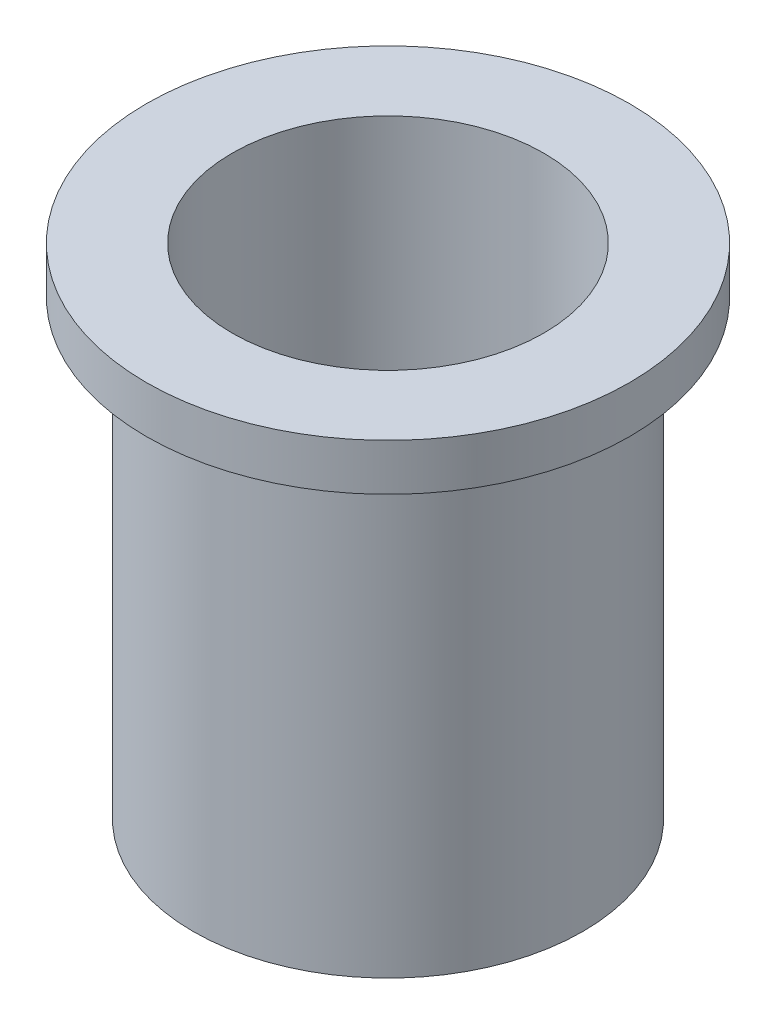
ISO-10303-21;
HEADER;
FILE_DESCRIPTION(('STEP AP214'),'2;1');
FILE_NAME('part.step','',(''),(''),'','','');
FILE_SCHEMA(('AUTOMOTIVE_DESIGN { 1 0 10303 214 1 1 1 1 }'));
ENDSEC;
DATA;
#1=APPLICATION_CONTEXT('core data for automotive mechanical design processes');
#2=APPLICATION_PROTOCOL_DEFINITION('international standard','automotive_design',2000,#1);
#3=PRODUCT_CONTEXT('',#1,'mechanical');
#4=PRODUCT('Part','Part','',(#3));
#5=PRODUCT_RELATED_PRODUCT_CATEGORY('part','',(#4));
#6=PRODUCT_DEFINITION_FORMATION('','',#4);
#7=PRODUCT_DEFINITION_CONTEXT('part definition',#1,'design');
#8=PRODUCT_DEFINITION('design','',#6,#7);
#9=PRODUCT_DEFINITION_SHAPE('','',#8);
#10=(LENGTH_UNIT() NAMED_UNIT(*) SI_UNIT(.MILLI.,.METRE.));
#11=(NAMED_UNIT(*) PLANE_ANGLE_UNIT() SI_UNIT($,.RADIAN.));
#12=(NAMED_UNIT(*) SI_UNIT($,.STERADIAN.) SOLID_ANGLE_UNIT());
#13=UNCERTAINTY_MEASURE_WITH_UNIT(LENGTH_MEASURE(1.E-05),#10,'distance_accuracy_value','');
#14=(GEOMETRIC_REPRESENTATION_CONTEXT(3) GLOBAL_UNCERTAINTY_ASSIGNED_CONTEXT((#13)) GLOBAL_UNIT_ASSIGNED_CONTEXT((#10,
#11,#12)) REPRESENTATION_CONTEXT('',''));
#15=CARTESIAN_POINT('',(0.,0.,0.));
#16=DIRECTION('',(0.,0.,1.));
#17=DIRECTION('',(1.,0.,0.));
#18=AXIS2_PLACEMENT_3D('',#15,#16,#17);
#19=CARTESIAN_POINT('',(25.,0.,0.));
#20=DIRECTION('',(0.,-1.,0.));
#21=DIRECTION('',(0.,0.,-1.));
#22=AXIS2_PLACEMENT_3D('',#19,#20,#21);
#23=PLANE('',#22);
#24=CARTESIAN_POINT('',(0.,0.,0.));
#25=DIRECTION('',(0.,-1.,0.));
#26=DIRECTION('',(0.,0.,-1.));
#27=AXIS2_PLACEMENT_3D('',#24,#25,#26);
#28=CIRCLE('',#27,25.);
#29=CARTESIAN_POINT('',(0.,0.,-25.));
#30=VERTEX_POINT('',#29);
#31=EDGE_CURVE('E70',#30,#30,#28,.T.);
#32=ORIENTED_EDGE('',*,*,#31,.T.);
#33=EDGE_LOOP('',(#32));
#34=FACE_BOUND('',#33,.T.);
#35=CARTESIAN_POINT('',(0.,0.,0.));
#36=DIRECTION('',(0.,-1.,0.));
#37=DIRECTION('',(0.,0.,-1.));
#38=AXIS2_PLACEMENT_3D('',#35,#36,#37);
#39=CIRCLE('',#38,20.);
#40=CARTESIAN_POINT('',(0.,0.,-20.));
#41=VERTEX_POINT('',#40);
#42=EDGE_CURVE('E10',#41,#41,#39,.T.);
#43=ORIENTED_EDGE('',*,*,#42,.F.);
#44=EDGE_LOOP('',(#43));
#45=FACE_BOUND('',#44,.T.);
#46=ADVANCED_FACE('F43',(#34,#45),#23,.T.);
#47=CARTESIAN_POINT('',(0.,0.,0.));
#48=DIRECTION('',(0.,-1.,0.));
#49=DIRECTION('',(0.,0.,-1.));
#50=AXIS2_PLACEMENT_3D('',#47,#48,#49);
#51=CYLINDRICAL_SURFACE('',#50,20.);
#52=ORIENTED_EDGE('',*,*,#42,.T.);
#53=EDGE_LOOP('',(#52));
#54=FACE_BOUND('',#53,.T.);
#55=CARTESIAN_POINT('',(0.,64.,0.));
#56=DIRECTION('',(0.,-1.,0.));
#57=DIRECTION('',(0.,0.,-1.));
#58=AXIS2_PLACEMENT_3D('',#55,#56,#57);
#59=CIRCLE('',#58,20.);
#60=CARTESIAN_POINT('',(0.,64.,-20.));
#61=VERTEX_POINT('',#60);
#62=EDGE_CURVE('E50',#61,#61,#59,.T.);
#63=ORIENTED_EDGE('',*,*,#62,.F.);
#64=EDGE_LOOP('',(#63));
#65=FACE_BOUND('',#64,.T.);
#66=ADVANCED_FACE('F89',(#54,#65),#51,.F.);
#67=CARTESIAN_POINT('',(20.,64.,0.));
#68=DIRECTION('',(0.,1.,0.));
#69=DIRECTION('',(0.,0.,1.));
#70=AXIS2_PLACEMENT_3D('',#67,#68,#69);
#71=PLANE('',#70);
#72=ORIENTED_EDGE('',*,*,#62,.T.);
#73=EDGE_LOOP('',(#72));
#74=FACE_BOUND('',#73,.T.);
#75=CARTESIAN_POINT('',(0.,64.,0.));
#76=DIRECTION('',(0.,-1.,0.));
#77=DIRECTION('',(0.,0.,-1.));
#78=AXIS2_PLACEMENT_3D('',#75,#76,#77);
#79=CIRCLE('',#78,31.);
#80=CARTESIAN_POINT('',(0.,64.,-31.));
#81=VERTEX_POINT('',#80);
#82=EDGE_CURVE('E55',#81,#81,#79,.T.);
#83=ORIENTED_EDGE('',*,*,#82,.F.);
#84=EDGE_LOOP('',(#83));
#85=FACE_BOUND('',#84,.T.);
#86=ADVANCED_FACE('F93',(#74,#85),#71,.T.);
#87=CARTESIAN_POINT('',(0.,0.,0.));
#88=DIRECTION('',(0.,-1.,0.));
#89=DIRECTION('',(0.,0.,-1.));
#90=AXIS2_PLACEMENT_3D('',#87,#88,#89);
#91=CYLINDRICAL_SURFACE('',#90,31.);
#92=ORIENTED_EDGE('',*,*,#82,.T.);
#93=EDGE_LOOP('',(#92));
#94=FACE_BOUND('',#93,.T.);
#95=CARTESIAN_POINT('',(0.,58.,0.));
#96=DIRECTION('',(0.,-1.,0.));
#97=DIRECTION('',(0.,0.,-1.));
#98=AXIS2_PLACEMENT_3D('',#95,#96,#97);
#99=CIRCLE('',#98,31.);
#100=CARTESIAN_POINT('',(0.,58.,-31.));
#101=VERTEX_POINT('',#100);
#102=EDGE_CURVE('E60',#101,#101,#99,.T.);
#103=ORIENTED_EDGE('',*,*,#102,.F.);
#104=EDGE_LOOP('',(#103));
#105=FACE_BOUND('',#104,.T.);
#106=ADVANCED_FACE('F85',(#94,#105),#91,.T.);
#107=CARTESIAN_POINT('',(31.,58.,0.));
#108=DIRECTION('',(0.,-1.,0.));
#109=DIRECTION('',(0.,0.,-1.));
#110=AXIS2_PLACEMENT_3D('',#107,#108,#109);
#111=PLANE('',#110);
#112=ORIENTED_EDGE('',*,*,#102,.T.);
#113=EDGE_LOOP('',(#112));
#114=FACE_BOUND('',#113,.T.);
#115=CARTESIAN_POINT('',(0.,58.,0.));
#116=DIRECTION('',(0.,-1.,0.));
#117=DIRECTION('',(0.,0.,-1.));
#118=AXIS2_PLACEMENT_3D('',#115,#116,#117);
#119=CIRCLE('',#118,25.);
#120=CARTESIAN_POINT('',(0.,58.,-25.));
#121=VERTEX_POINT('',#120);
#122=EDGE_CURVE('E66',#121,#121,#119,.T.);
#123=ORIENTED_EDGE('',*,*,#122,.F.);
#124=EDGE_LOOP('',(#123));
#125=FACE_BOUND('',#124,.T.);
#126=ADVANCED_FACE('F79',(#114,#125),#111,.T.);
#127=CARTESIAN_POINT('',(0.,0.,0.));
#128=DIRECTION('',(0.,-1.,0.));
#129=DIRECTION('',(0.,0.,-1.));
#130=AXIS2_PLACEMENT_3D('',#127,#128,#129);
#131=CYLINDRICAL_SURFACE('',#130,25.);
#132=ORIENTED_EDGE('',*,*,#122,.T.);
#133=EDGE_LOOP('',(#132));
#134=FACE_BOUND('',#133,.T.);
#135=ORIENTED_EDGE('',*,*,#31,.F.);
#136=EDGE_LOOP('',(#135));
#137=FACE_BOUND('',#136,.T.);
#138=ADVANCED_FACE('F77',(#134,#137),#131,.T.);
#139=CLOSED_SHELL('',(#46,#66,#86,#106,#126,#138));
#140=MANIFOLD_SOLID_BREP('B2',#139);
#141=ADVANCED_BREP_SHAPE_REPRESENTATION('',(#18,#140),#14);
#142=SHAPE_DEFINITION_REPRESENTATION(#9,#141);
ENDSEC;
END-ISO-10303-21;
